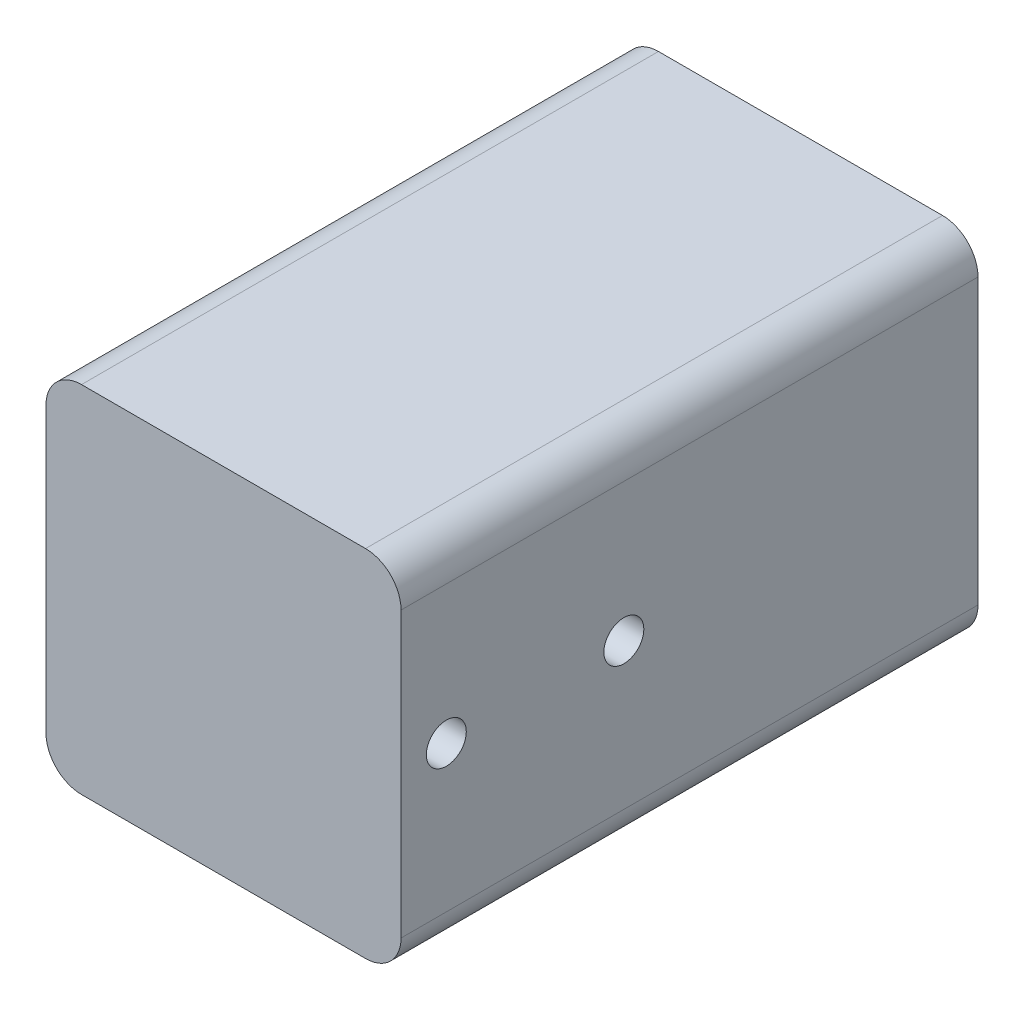
ISO-10303-21;
HEADER;
FILE_DESCRIPTION(('STEP AP214'),'2;1');
FILE_NAME('part.step','',(''),(''),'','','');
FILE_SCHEMA(('AUTOMOTIVE_DESIGN { 1 0 10303 214 1 1 1 1 }'));
ENDSEC;
DATA;
#1=APPLICATION_CONTEXT('core data for automotive mechanical design processes');
#2=APPLICATION_PROTOCOL_DEFINITION('international standard','automotive_design',2000,#1);
#3=PRODUCT_CONTEXT('',#1,'mechanical');
#4=PRODUCT('Part','Part','',(#3));
#5=PRODUCT_RELATED_PRODUCT_CATEGORY('part','',(#4));
#6=PRODUCT_DEFINITION_FORMATION('','',#4);
#7=PRODUCT_DEFINITION_CONTEXT('part definition',#1,'design');
#8=PRODUCT_DEFINITION('design','',#6,#7);
#9=PRODUCT_DEFINITION_SHAPE('','',#8);
#10=(LENGTH_UNIT() NAMED_UNIT(*) SI_UNIT(.MILLI.,.METRE.));
#11=(NAMED_UNIT(*) PLANE_ANGLE_UNIT() SI_UNIT($,.RADIAN.));
#12=(NAMED_UNIT(*) SI_UNIT($,.STERADIAN.) SOLID_ANGLE_UNIT());
#13=UNCERTAINTY_MEASURE_WITH_UNIT(LENGTH_MEASURE(1.E-05),#10,'distance_accuracy_value','');
#14=(GEOMETRIC_REPRESENTATION_CONTEXT(3) GLOBAL_UNCERTAINTY_ASSIGNED_CONTEXT((#13)) GLOBAL_UNIT_ASSIGNED_CONTEXT((#10,
#11,#12)) REPRESENTATION_CONTEXT('',''));
#15=CARTESIAN_POINT('',(0.,0.,0.));
#16=DIRECTION('',(0.,0.,1.));
#17=DIRECTION('',(1.,0.,0.));
#18=AXIS2_PLACEMENT_3D('',#15,#16,#17);
#19=CARTESIAN_POINT('',(-16.,-16.,0.));
#20=DIRECTION('',(0.,0.,1.));
#21=DIRECTION('',(1.,0.,0.));
#22=AXIS2_PLACEMENT_3D('',#19,#20,#21);
#23=PLANE('',#22);
#24=CARTESIAN_POINT('',(-12.3743686707646,12.3743686707653,0.));
#25=DIRECTION('',(0.,0.,-1.));
#26=DIRECTION('',(-1.,0.,0.));
#27=AXIS2_PLACEMENT_3D('',#24,#25,#26);
#28=CIRCLE('',#27,3.29999999999999);
#29=CARTESIAN_POINT('',(-15.6743686707646,12.3743686707653,0.));
#30=VERTEX_POINT('',#29);
#31=EDGE_CURVE('E201',#30,#30,#28,.T.);
#32=ORIENTED_EDGE('',*,*,#31,.F.);
#33=EDGE_LOOP('',(#32));
#34=FACE_BOUND('',#33,.T.);
#35=CARTESIAN_POINT('',(12.3743686707646,12.3743686707646,0.));
#36=DIRECTION('',(0.,0.,-1.));
#37=DIRECTION('',(-1.,0.,0.));
#38=AXIS2_PLACEMENT_3D('',#35,#36,#37);
#39=CIRCLE('',#38,3.29999999999999);
#40=CARTESIAN_POINT('',(9.0743686707646,12.3743686707646,0.));
#41=VERTEX_POINT('',#40);
#42=EDGE_CURVE('E195',#41,#41,#39,.T.);
#43=ORIENTED_EDGE('',*,*,#42,.F.);
#44=EDGE_LOOP('',(#43));
#45=FACE_BOUND('',#44,.T.);
#46=CARTESIAN_POINT('',(12.3743686707639,-12.3743686707646,0.));
#47=DIRECTION('',(0.,0.,-1.));
#48=DIRECTION('',(-1.,0.,0.));
#49=AXIS2_PLACEMENT_3D('',#46,#47,#48);
#50=CIRCLE('',#49,3.29999999999999);
#51=CARTESIAN_POINT('',(9.07436867076389,-12.3743686707646,0.));
#52=VERTEX_POINT('',#51);
#53=EDGE_CURVE('E189',#52,#52,#50,.T.);
#54=ORIENTED_EDGE('',*,*,#53,.F.);
#55=EDGE_LOOP('',(#54));
#56=FACE_BOUND('',#55,.T.);
#57=CARTESIAN_POINT('',(-16.,-16.,0.));
#58=DIRECTION('',(0.,0.,1.));
#59=DIRECTION('',(1.,0.,0.));
#60=AXIS2_PLACEMENT_3D('',#57,#58,#59);
#61=CIRCLE('',#60,4.);
#62=CARTESIAN_POINT('',(-20.,-16.,0.));
#63=VERTEX_POINT('',#62);
#64=CARTESIAN_POINT('',(-16.,-20.,0.));
#65=VERTEX_POINT('',#64);
#66=EDGE_CURVE('E133',#63,#65,#61,.T.);
#67=ORIENTED_EDGE('',*,*,#66,.F.);
#68=DIRECTION('',(0.,-1.,0.));
#69=VECTOR('',#68,1.);
#70=CARTESIAN_POINT('',(-20.,-16.,0.));
#71=LINE('',#70,#69);
#72=CARTESIAN_POINT('',(-20.,16.,0.));
#73=VERTEX_POINT('',#72);
#74=EDGE_CURVE('E86',#73,#63,#71,.T.);
#75=ORIENTED_EDGE('',*,*,#74,.F.);
#76=CARTESIAN_POINT('',(-16.,16.,0.));
#77=DIRECTION('',(0.,0.,1.));
#78=DIRECTION('',(-1.,0.,0.));
#79=AXIS2_PLACEMENT_3D('',#76,#77,#78);
#80=CIRCLE('',#79,4.);
#81=CARTESIAN_POINT('',(-16.,20.,0.));
#82=VERTEX_POINT('',#81);
#83=EDGE_CURVE('E80',#82,#73,#80,.T.);
#84=ORIENTED_EDGE('',*,*,#83,.F.);
#85=DIRECTION('',(-1.,0.,0.));
#86=VECTOR('',#85,1.);
#87=CARTESIAN_POINT('',(-16.,20.,0.));
#88=LINE('',#87,#86);
#89=CARTESIAN_POINT('',(16.,20.,0.));
#90=VERTEX_POINT('',#89);
#91=EDGE_CURVE('E123',#90,#82,#88,.T.);
#92=ORIENTED_EDGE('',*,*,#91,.F.);
#93=CARTESIAN_POINT('',(16.,16.,0.));
#94=DIRECTION('',(0.,0.,1.));
#95=DIRECTION('',(1.,0.,0.));
#96=AXIS2_PLACEMENT_3D('',#93,#94,#95);
#97=CIRCLE('',#96,4.);
#98=CARTESIAN_POINT('',(20.,16.,0.));
#99=VERTEX_POINT('',#98);
#100=EDGE_CURVE('E143',#99,#90,#97,.T.);
#101=ORIENTED_EDGE('',*,*,#100,.F.);
#102=DIRECTION('',(0.,1.,0.));
#103=VECTOR('',#102,1.);
#104=CARTESIAN_POINT('',(20.,-16.,0.));
#105=LINE('',#104,#103);
#106=CARTESIAN_POINT('',(20.,-16.,0.));
#107=VERTEX_POINT('',#106);
#108=EDGE_CURVE('E141',#107,#99,#105,.T.);
#109=ORIENTED_EDGE('',*,*,#108,.F.);
#110=CARTESIAN_POINT('',(16.,-16.,0.));
#111=DIRECTION('',(0.,0.,1.));
#112=DIRECTION('',(1.,0.,0.));
#113=AXIS2_PLACEMENT_3D('',#110,#111,#112);
#114=CIRCLE('',#113,4.);
#115=CARTESIAN_POINT('',(16.,-20.,0.));
#116=VERTEX_POINT('',#115);
#117=EDGE_CURVE('E139',#116,#107,#114,.T.);
#118=ORIENTED_EDGE('',*,*,#117,.F.);
#119=DIRECTION('',(1.,0.,0.));
#120=VECTOR('',#119,1.);
#121=CARTESIAN_POINT('',(-16.,-20.,0.));
#122=LINE('',#121,#120);
#123=EDGE_CURVE('E136',#65,#116,#122,.T.);
#124=ORIENTED_EDGE('',*,*,#123,.F.);
#125=EDGE_LOOP('',(#67,#75,#84,#92,#101,#109,#118,#124));
#126=FACE_BOUND('',#125,.T.);
#127=CARTESIAN_POINT('',(-12.3743686707653,-12.3743686707639,0.));
#128=DIRECTION('',(0.,0.,-1.));
#129=DIRECTION('',(-1.,0.,0.));
#130=AXIS2_PLACEMENT_3D('',#127,#128,#129);
#131=CIRCLE('',#130,3.29999999999999);
#132=CARTESIAN_POINT('',(-15.6743686707653,-12.3743686707639,0.));
#133=VERTEX_POINT('',#132);
#134=EDGE_CURVE('E183',#133,#133,#131,.T.);
#135=ORIENTED_EDGE('',*,*,#134,.F.);
#136=EDGE_LOOP('',(#135));
#137=FACE_BOUND('',#136,.T.);
#138=ADVANCED_FACE('F33',(#34,#45,#56,#126,#137),#23,.F.);
#139=CARTESIAN_POINT('',(-16.,-16.,65.));
#140=DIRECTION('',(0.,0.,-1.));
#141=DIRECTION('',(-1.,0.,0.));
#142=AXIS2_PLACEMENT_3D('',#139,#140,#141);
#143=CYLINDRICAL_SURFACE('',#142,4.);
#144=ORIENTED_EDGE('',*,*,#66,.T.);
#145=DIRECTION('',(0.,0.,-1.));
#146=VECTOR('',#145,1.);
#147=CARTESIAN_POINT('',(-16.,-20.,65.));
#148=LINE('',#147,#146);
#149=CARTESIAN_POINT('',(-16.,-20.,65.));
#150=VERTEX_POINT('',#149);
#151=EDGE_CURVE('E11',#150,#65,#148,.T.);
#152=ORIENTED_EDGE('',*,*,#151,.F.);
#153=CARTESIAN_POINT('',(-16.,-16.,65.));
#154=DIRECTION('',(0.,0.,1.));
#155=DIRECTION('',(1.,0.,0.));
#156=AXIS2_PLACEMENT_3D('',#153,#154,#155);
#157=CIRCLE('',#156,4.);
#158=CARTESIAN_POINT('',(-20.,-16.,65.));
#159=VERTEX_POINT('',#158);
#160=EDGE_CURVE('E148',#159,#150,#157,.T.);
#161=ORIENTED_EDGE('',*,*,#160,.F.);
#162=DIRECTION('',(0.,0.,-1.));
#163=VECTOR('',#162,1.);
#164=CARTESIAN_POINT('',(-20.,-16.,65.));
#165=LINE('',#164,#163);
#166=EDGE_CURVE('E129',#159,#63,#165,.T.);
#167=ORIENTED_EDGE('',*,*,#166,.T.);
#168=EDGE_LOOP('',(#144,#152,#161,#167));
#169=FACE_BOUND('',#168,.T.);
#170=ADVANCED_FACE('F35',(#169),#143,.T.);
#171=CARTESIAN_POINT('',(-16.,-20.,65.));
#172=DIRECTION('',(0.,1.,0.));
#173=DIRECTION('',(0.,0.,1.));
#174=AXIS2_PLACEMENT_3D('',#171,#172,#173);
#175=PLANE('',#174);
#176=ORIENTED_EDGE('',*,*,#123,.T.);
#177=DIRECTION('',(0.,0.,-1.));
#178=VECTOR('',#177,1.);
#179=CARTESIAN_POINT('',(16.,-20.,65.));
#180=LINE('',#179,#178);
#181=CARTESIAN_POINT('',(16.,-20.,65.));
#182=VERTEX_POINT('',#181);
#183=EDGE_CURVE('E42',#182,#116,#180,.T.);
#184=ORIENTED_EDGE('',*,*,#183,.F.);
#185=DIRECTION('',(1.,0.,0.));
#186=VECTOR('',#185,1.);
#187=CARTESIAN_POINT('',(-16.,-20.,65.));
#188=LINE('',#187,#186);
#189=EDGE_CURVE('E94',#150,#182,#188,.T.);
#190=ORIENTED_EDGE('',*,*,#189,.F.);
#191=ORIENTED_EDGE('',*,*,#151,.T.);
#192=EDGE_LOOP('',(#176,#184,#190,#191));
#193=FACE_BOUND('',#192,.T.);
#194=ADVANCED_FACE('F248',(#193),#175,.F.);
#195=CARTESIAN_POINT('',(16.,-16.,65.));
#196=DIRECTION('',(0.,0.,-1.));
#197=DIRECTION('',(-1.,0.,0.));
#198=AXIS2_PLACEMENT_3D('',#195,#196,#197);
#199=CYLINDRICAL_SURFACE('',#198,4.);
#200=ORIENTED_EDGE('',*,*,#117,.T.);
#201=DIRECTION('',(0.,0.,-1.));
#202=VECTOR('',#201,1.);
#203=CARTESIAN_POINT('',(20.,-16.,65.));
#204=LINE('',#203,#202);
#205=CARTESIAN_POINT('',(20.,-16.,65.));
#206=VERTEX_POINT('',#205);
#207=EDGE_CURVE('E155',#206,#107,#204,.T.);
#208=ORIENTED_EDGE('',*,*,#207,.F.);
#209=CARTESIAN_POINT('',(16.,-16.,65.));
#210=DIRECTION('',(0.,0.,1.));
#211=DIRECTION('',(1.,0.,0.));
#212=AXIS2_PLACEMENT_3D('',#209,#210,#211);
#213=CIRCLE('',#212,4.);
#214=EDGE_CURVE('E163',#182,#206,#213,.T.);
#215=ORIENTED_EDGE('',*,*,#214,.F.);
#216=ORIENTED_EDGE('',*,*,#183,.T.);
#217=EDGE_LOOP('',(#200,#208,#215,#216));
#218=FACE_BOUND('',#217,.T.);
#219=ADVANCED_FACE('F161',(#218),#199,.T.);
#220=CARTESIAN_POINT('',(20.,-16.,65.));
#221=DIRECTION('',(-1.,0.,0.));
#222=DIRECTION('',(0.,0.,1.));
#223=AXIS2_PLACEMENT_3D('',#220,#221,#222);
#224=PLANE('',#223);
#225=CARTESIAN_POINT('',(20.,0.46049902811721,59.8999999991176));
#226=DIRECTION('',(1.,0.,0.));
#227=DIRECTION('',(0.,0.,-1.));
#228=AXIS2_PLACEMENT_3D('',#225,#226,#227);
#229=CIRCLE('',#228,2.25);
#230=CARTESIAN_POINT('',(20.,0.46049902811721,57.6499999991176));
#231=VERTEX_POINT('',#230);
#232=EDGE_CURVE('E213',#231,#231,#229,.T.);
#233=ORIENTED_EDGE('',*,*,#232,.F.);
#234=EDGE_LOOP('',(#233));
#235=FACE_BOUND('',#234,.T.);
#236=CARTESIAN_POINT('',(20.,0.460499028117237,39.8999999991176));
#237=DIRECTION('',(1.,0.,0.));
#238=DIRECTION('',(0.,0.,-1.));
#239=AXIS2_PLACEMENT_3D('',#236,#237,#238);
#240=CIRCLE('',#239,2.25);
#241=CARTESIAN_POINT('',(20.,0.460499028117237,37.6499999991176));
#242=VERTEX_POINT('',#241);
#243=EDGE_CURVE('E207',#242,#242,#240,.T.);
#244=ORIENTED_EDGE('',*,*,#243,.F.);
#245=EDGE_LOOP('',(#244));
#246=FACE_BOUND('',#245,.T.);
#247=ORIENTED_EDGE('',*,*,#108,.T.);
#248=DIRECTION('',(0.,0.,-1.));
#249=VECTOR('',#248,1.);
#250=CARTESIAN_POINT('',(20.,16.,65.));
#251=LINE('',#250,#249);
#252=CARTESIAN_POINT('',(20.,16.,65.));
#253=VERTEX_POINT('',#252);
#254=EDGE_CURVE('E152',#253,#99,#251,.T.);
#255=ORIENTED_EDGE('',*,*,#254,.F.);
#256=DIRECTION('',(0.,1.,0.));
#257=VECTOR('',#256,1.);
#258=CARTESIAN_POINT('',(20.,-16.,65.));
#259=LINE('',#258,#257);
#260=EDGE_CURVE('E175',#206,#253,#259,.T.);
#261=ORIENTED_EDGE('',*,*,#260,.F.);
#262=ORIENTED_EDGE('',*,*,#207,.T.);
#263=EDGE_LOOP('',(#247,#255,#261,#262));
#264=FACE_BOUND('',#263,.T.);
#265=ADVANCED_FACE('F171',(#235,#246,#264),#224,.F.);
#266=CARTESIAN_POINT('',(16.,16.,65.));
#267=DIRECTION('',(0.,0.,-1.));
#268=DIRECTION('',(-1.,0.,0.));
#269=AXIS2_PLACEMENT_3D('',#266,#267,#268);
#270=CYLINDRICAL_SURFACE('',#269,4.);
#271=ORIENTED_EDGE('',*,*,#100,.T.);
#272=DIRECTION('',(0.,0.,-1.));
#273=VECTOR('',#272,1.);
#274=CARTESIAN_POINT('',(16.,20.,65.));
#275=LINE('',#274,#273);
#276=CARTESIAN_POINT('',(16.,20.,65.));
#277=VERTEX_POINT('',#276);
#278=EDGE_CURVE('E124',#277,#90,#275,.T.);
#279=ORIENTED_EDGE('',*,*,#278,.F.);
#280=CARTESIAN_POINT('',(16.,16.,65.));
#281=DIRECTION('',(0.,0.,1.));
#282=DIRECTION('',(1.,0.,0.));
#283=AXIS2_PLACEMENT_3D('',#280,#281,#282);
#284=CIRCLE('',#283,4.);
#285=EDGE_CURVE('E115',#253,#277,#284,.T.);
#286=ORIENTED_EDGE('',*,*,#285,.F.);
#287=ORIENTED_EDGE('',*,*,#254,.T.);
#288=EDGE_LOOP('',(#271,#279,#286,#287));
#289=FACE_BOUND('',#288,.T.);
#290=ADVANCED_FACE('F174',(#289),#270,.T.);
#291=CARTESIAN_POINT('',(-16.,20.,65.));
#292=DIRECTION('',(0.,-1.,0.));
#293=DIRECTION('',(0.,0.,-1.));
#294=AXIS2_PLACEMENT_3D('',#291,#292,#293);
#295=PLANE('',#294);
#296=ORIENTED_EDGE('',*,*,#91,.T.);
#297=DIRECTION('',(0.,0.,-1.));
#298=VECTOR('',#297,1.);
#299=CARTESIAN_POINT('',(-16.,20.,65.));
#300=LINE('',#299,#298);
#301=CARTESIAN_POINT('',(-16.,20.,65.));
#302=VERTEX_POINT('',#301);
#303=EDGE_CURVE('E120',#302,#82,#300,.T.);
#304=ORIENTED_EDGE('',*,*,#303,.F.);
#305=DIRECTION('',(-1.,0.,0.));
#306=VECTOR('',#305,1.);
#307=CARTESIAN_POINT('',(-16.,20.,65.));
#308=LINE('',#307,#306);
#309=EDGE_CURVE('E109',#277,#302,#308,.T.);
#310=ORIENTED_EDGE('',*,*,#309,.F.);
#311=ORIENTED_EDGE('',*,*,#278,.T.);
#312=EDGE_LOOP('',(#296,#304,#310,#311));
#313=FACE_BOUND('',#312,.T.);
#314=ADVANCED_FACE('F121',(#313),#295,.F.);
#315=CARTESIAN_POINT('',(-16.,16.,65.));
#316=DIRECTION('',(0.,0.,-1.));
#317=DIRECTION('',(-1.,0.,0.));
#318=AXIS2_PLACEMENT_3D('',#315,#316,#317);
#319=CYLINDRICAL_SURFACE('',#318,4.);
#320=ORIENTED_EDGE('',*,*,#83,.T.);
#321=DIRECTION('',(0.,0.,-1.));
#322=VECTOR('',#321,1.);
#323=CARTESIAN_POINT('',(-20.,16.,65.));
#324=LINE('',#323,#322);
#325=CARTESIAN_POINT('',(-20.,16.,65.));
#326=VERTEX_POINT('',#325);
#327=EDGE_CURVE('E125',#326,#73,#324,.T.);
#328=ORIENTED_EDGE('',*,*,#327,.F.);
#329=CARTESIAN_POINT('',(-16.,16.,65.));
#330=DIRECTION('',(0.,0.,1.));
#331=DIRECTION('',(-1.,0.,0.));
#332=AXIS2_PLACEMENT_3D('',#329,#330,#331);
#333=CIRCLE('',#332,4.);
#334=EDGE_CURVE('E113',#302,#326,#333,.T.);
#335=ORIENTED_EDGE('',*,*,#334,.F.);
#336=ORIENTED_EDGE('',*,*,#303,.T.);
#337=EDGE_LOOP('',(#320,#328,#335,#336));
#338=FACE_BOUND('',#337,.T.);
#339=ADVANCED_FACE('F127',(#338),#319,.T.);
#340=CARTESIAN_POINT('',(-20.,-16.,65.));
#341=DIRECTION('',(1.,0.,0.));
#342=DIRECTION('',(0.,0.,-1.));
#343=AXIS2_PLACEMENT_3D('',#340,#341,#342);
#344=PLANE('',#343);
#345=ORIENTED_EDGE('',*,*,#74,.T.);
#346=ORIENTED_EDGE('',*,*,#166,.F.);
#347=DIRECTION('',(0.,-1.,0.));
#348=VECTOR('',#347,1.);
#349=CARTESIAN_POINT('',(-20.,-16.,65.));
#350=LINE('',#349,#348);
#351=EDGE_CURVE('E50',#326,#159,#350,.T.);
#352=ORIENTED_EDGE('',*,*,#351,.F.);
#353=ORIENTED_EDGE('',*,*,#327,.T.);
#354=EDGE_LOOP('',(#345,#346,#352,#353));
#355=FACE_BOUND('',#354,.T.);
#356=ADVANCED_FACE('F255',(#355),#344,.F.);
#357=CARTESIAN_POINT('',(-16.,-16.,65.));
#358=DIRECTION('',(0.,0.,1.));
#359=DIRECTION('',(1.,0.,0.));
#360=AXIS2_PLACEMENT_3D('',#357,#358,#359);
#361=PLANE('',#360);
#362=ORIENTED_EDGE('',*,*,#160,.T.);
#363=ORIENTED_EDGE('',*,*,#189,.T.);
#364=ORIENTED_EDGE('',*,*,#214,.T.);
#365=ORIENTED_EDGE('',*,*,#260,.T.);
#366=ORIENTED_EDGE('',*,*,#285,.T.);
#367=ORIENTED_EDGE('',*,*,#309,.T.);
#368=ORIENTED_EDGE('',*,*,#334,.T.);
#369=ORIENTED_EDGE('',*,*,#351,.T.);
#370=EDGE_LOOP('',(#362,#363,#364,#365,#366,#367,#368,#369));
#371=FACE_BOUND('',#370,.T.);
#372=ADVANCED_FACE('F111',(#371),#361,.T.);
#373=CARTESIAN_POINT('',(-12.3743686707653,-12.3743686707639,5.));
#374=DIRECTION('',(0.,0.,-1.));
#375=DIRECTION('',(-1.,0.,0.));
#376=AXIS2_PLACEMENT_3D('',#373,#374,#375);
#377=CONICAL_SURFACE('',#376,3.3,1.02974425867665);
#378=CARTESIAN_POINT('',(-12.3743686707653,-12.3743686707639,6.98284004279095));
#379=VERTEX_POINT('',#378);
#380=VERTEX_LOOP('',#379);
#381=FACE_BOUND('',#380,.T.);
#382=CARTESIAN_POINT('',(-12.3743686707653,-12.3743686707639,5.));
#383=DIRECTION('',(0.,0.,-1.));
#384=DIRECTION('',(-1.,0.,0.));
#385=AXIS2_PLACEMENT_3D('',#382,#383,#384);
#386=CIRCLE('',#385,3.3);
#387=CARTESIAN_POINT('',(-15.6743686707653,-12.3743686707639,5.));
#388=VERTEX_POINT('',#387);
#389=EDGE_CURVE('E137',#388,#388,#386,.T.);
#390=ORIENTED_EDGE('',*,*,#389,.T.);
#391=EDGE_LOOP('',(#390));
#392=FACE_BOUND('',#391,.T.);
#393=ADVANCED_FACE('F305',(#381,#392),#377,.F.);
#394=CARTESIAN_POINT('',(-12.3743686707653,-12.3743686707639,0.));
#395=DIRECTION('',(0.,0.,-1.));
#396=DIRECTION('',(-1.,0.,0.));
#397=AXIS2_PLACEMENT_3D('',#394,#395,#396);
#398=CYLINDRICAL_SURFACE('',#397,3.29999999999999);
#399=ORIENTED_EDGE('',*,*,#389,.F.);
#400=EDGE_LOOP('',(#399));
#401=FACE_BOUND('',#400,.T.);
#402=ORIENTED_EDGE('',*,*,#134,.T.);
#403=EDGE_LOOP('',(#402));
#404=FACE_BOUND('',#403,.T.);
#405=ADVANCED_FACE('F315',(#401,#404),#398,.F.);
#406=CARTESIAN_POINT('',(12.3743686707639,-12.3743686707646,5.));
#407=DIRECTION('',(0.,0.,-1.));
#408=DIRECTION('',(-1.,0.,0.));
#409=AXIS2_PLACEMENT_3D('',#406,#407,#408);
#410=CONICAL_SURFACE('',#409,3.3,1.02974425867665);
#411=CARTESIAN_POINT('',(12.3743686707639,-12.3743686707646,6.98284004279095));
#412=VERTEX_POINT('',#411);
#413=VERTEX_LOOP('',#412);
#414=FACE_BOUND('',#413,.T.);
#415=CARTESIAN_POINT('',(12.3743686707639,-12.3743686707646,5.));
#416=DIRECTION('',(0.,0.,-1.));
#417=DIRECTION('',(-1.,0.,0.));
#418=AXIS2_PLACEMENT_3D('',#415,#416,#417);
#419=CIRCLE('',#418,3.3);
#420=CARTESIAN_POINT('',(9.07436867076388,-12.3743686707646,5.));
#421=VERTEX_POINT('',#420);
#422=EDGE_CURVE('E186',#421,#421,#419,.T.);
#423=ORIENTED_EDGE('',*,*,#422,.T.);
#424=EDGE_LOOP('',(#423));
#425=FACE_BOUND('',#424,.T.);
#426=ADVANCED_FACE('F321',(#414,#425),#410,.F.);
#427=CARTESIAN_POINT('',(12.3743686707639,-12.3743686707646,0.));
#428=DIRECTION('',(0.,0.,-1.));
#429=DIRECTION('',(-1.,0.,0.));
#430=AXIS2_PLACEMENT_3D('',#427,#428,#429);
#431=CYLINDRICAL_SURFACE('',#430,3.29999999999999);
#432=ORIENTED_EDGE('',*,*,#422,.F.);
#433=EDGE_LOOP('',(#432));
#434=FACE_BOUND('',#433,.T.);
#435=ORIENTED_EDGE('',*,*,#53,.T.);
#436=EDGE_LOOP('',(#435));
#437=FACE_BOUND('',#436,.T.);
#438=ADVANCED_FACE('F329',(#434,#437),#431,.F.);
#439=CARTESIAN_POINT('',(12.3743686707646,12.3743686707646,5.));
#440=DIRECTION('',(0.,0.,-1.));
#441=DIRECTION('',(-1.,0.,0.));
#442=AXIS2_PLACEMENT_3D('',#439,#440,#441);
#443=CONICAL_SURFACE('',#442,3.3,1.02974425867665);
#444=CARTESIAN_POINT('',(12.3743686707646,12.3743686707646,6.98284004279095));
#445=VERTEX_POINT('',#444);
#446=VERTEX_LOOP('',#445);
#447=FACE_BOUND('',#446,.T.);
#448=CARTESIAN_POINT('',(12.3743686707646,12.3743686707646,5.));
#449=DIRECTION('',(0.,0.,-1.));
#450=DIRECTION('',(-1.,0.,0.));
#451=AXIS2_PLACEMENT_3D('',#448,#449,#450);
#452=CIRCLE('',#451,3.3);
#453=CARTESIAN_POINT('',(9.0743686707646,12.3743686707646,5.));
#454=VERTEX_POINT('',#453);
#455=EDGE_CURVE('E192',#454,#454,#452,.T.);
#456=ORIENTED_EDGE('',*,*,#455,.T.);
#457=EDGE_LOOP('',(#456));
#458=FACE_BOUND('',#457,.T.);
#459=ADVANCED_FACE('F337',(#447,#458),#443,.F.);
#460=CARTESIAN_POINT('',(12.3743686707646,12.3743686707646,0.));
#461=DIRECTION('',(0.,0.,-1.));
#462=DIRECTION('',(-1.,0.,0.));
#463=AXIS2_PLACEMENT_3D('',#460,#461,#462);
#464=CYLINDRICAL_SURFACE('',#463,3.29999999999999);
#465=ORIENTED_EDGE('',*,*,#455,.F.);
#466=EDGE_LOOP('',(#465));
#467=FACE_BOUND('',#466,.T.);
#468=ORIENTED_EDGE('',*,*,#42,.T.);
#469=EDGE_LOOP('',(#468));
#470=FACE_BOUND('',#469,.T.);
#471=ADVANCED_FACE('F345',(#467,#470),#464,.F.);
#472=CARTESIAN_POINT('',(-12.3743686707646,12.3743686707653,5.));
#473=DIRECTION('',(0.,0.,-1.));
#474=DIRECTION('',(-1.,0.,0.));
#475=AXIS2_PLACEMENT_3D('',#472,#473,#474);
#476=CONICAL_SURFACE('',#475,3.3,1.02974425867665);
#477=CARTESIAN_POINT('',(-12.3743686707646,12.3743686707653,6.98284004279095));
#478=VERTEX_POINT('',#477);
#479=VERTEX_LOOP('',#478);
#480=FACE_BOUND('',#479,.T.);
#481=CARTESIAN_POINT('',(-12.3743686707646,12.3743686707653,5.));
#482=DIRECTION('',(0.,0.,-1.));
#483=DIRECTION('',(-1.,0.,0.));
#484=AXIS2_PLACEMENT_3D('',#481,#482,#483);
#485=CIRCLE('',#484,3.3);
#486=CARTESIAN_POINT('',(-15.6743686707646,12.3743686707653,5.));
#487=VERTEX_POINT('',#486);
#488=EDGE_CURVE('E198',#487,#487,#485,.T.);
#489=ORIENTED_EDGE('',*,*,#488,.T.);
#490=EDGE_LOOP('',(#489));
#491=FACE_BOUND('',#490,.T.);
#492=ADVANCED_FACE('F353',(#480,#491),#476,.F.);
#493=CARTESIAN_POINT('',(-12.3743686707646,12.3743686707653,0.));
#494=DIRECTION('',(0.,0.,-1.));
#495=DIRECTION('',(-1.,0.,0.));
#496=AXIS2_PLACEMENT_3D('',#493,#494,#495);
#497=CYLINDRICAL_SURFACE('',#496,3.29999999999999);
#498=ORIENTED_EDGE('',*,*,#488,.F.);
#499=EDGE_LOOP('',(#498));
#500=FACE_BOUND('',#499,.T.);
#501=ORIENTED_EDGE('',*,*,#31,.T.);
#502=EDGE_LOOP('',(#501));
#503=FACE_BOUND('',#502,.T.);
#504=ADVANCED_FACE('F236',(#500,#503),#497,.F.);
#505=CARTESIAN_POINT('',(15.,0.460499028117237,39.8999999991176));
#506=DIRECTION('',(1.,0.,0.));
#507=DIRECTION('',(0.,0.,-1.));
#508=AXIS2_PLACEMENT_3D('',#505,#506,#507);
#509=CONICAL_SURFACE('',#508,2.25,1.02974425867665);
#510=CARTESIAN_POINT('',(13.648063607188,0.460499028117236,39.8999999991176));
#511=VERTEX_POINT('',#510);
#512=VERTEX_LOOP('',#511);
#513=FACE_BOUND('',#512,.T.);
#514=CARTESIAN_POINT('',(15.,0.460499028117237,39.8999999991176));
#515=DIRECTION('',(1.,0.,0.));
#516=DIRECTION('',(0.,0.,-1.));
#517=AXIS2_PLACEMENT_3D('',#514,#515,#516);
#518=CIRCLE('',#517,2.25);
#519=CARTESIAN_POINT('',(15.,0.460499028117237,37.6499999991176));
#520=VERTEX_POINT('',#519);
#521=EDGE_CURVE('E204',#520,#520,#518,.T.);
#522=ORIENTED_EDGE('',*,*,#521,.T.);
#523=EDGE_LOOP('',(#522));
#524=FACE_BOUND('',#523,.T.);
#525=ADVANCED_FACE('F227',(#513,#524),#509,.F.);
#526=CARTESIAN_POINT('',(20.,0.460499028117237,39.8999999991176));
#527=DIRECTION('',(1.,0.,0.));
#528=DIRECTION('',(0.,0.,-1.));
#529=AXIS2_PLACEMENT_3D('',#526,#527,#528);
#530=CYLINDRICAL_SURFACE('',#529,2.25);
#531=ORIENTED_EDGE('',*,*,#521,.F.);
#532=EDGE_LOOP('',(#531));
#533=FACE_BOUND('',#532,.T.);
#534=ORIENTED_EDGE('',*,*,#243,.T.);
#535=EDGE_LOOP('',(#534));
#536=FACE_BOUND('',#535,.T.);
#537=ADVANCED_FACE('F224',(#533,#536),#530,.F.);
#538=CARTESIAN_POINT('',(15.,0.46049902811721,59.8999999991176));
#539=DIRECTION('',(1.,0.,0.));
#540=DIRECTION('',(0.,0.,-1.));
#541=AXIS2_PLACEMENT_3D('',#538,#539,#540);
#542=CONICAL_SURFACE('',#541,2.25,1.02974425867665);
#543=CARTESIAN_POINT('',(13.648063607188,0.460499028117208,59.8999999991176));
#544=VERTEX_POINT('',#543);
#545=VERTEX_LOOP('',#544);
#546=FACE_BOUND('',#545,.T.);
#547=CARTESIAN_POINT('',(15.,0.46049902811721,59.8999999991176));
#548=DIRECTION('',(1.,0.,0.));
#549=DIRECTION('',(0.,0.,-1.));
#550=AXIS2_PLACEMENT_3D('',#547,#548,#549);
#551=CIRCLE('',#550,2.25);
#552=CARTESIAN_POINT('',(15.,0.46049902811721,57.6499999991176));
#553=VERTEX_POINT('',#552);
#554=EDGE_CURVE('E210',#553,#553,#551,.T.);
#555=ORIENTED_EDGE('',*,*,#554,.T.);
#556=EDGE_LOOP('',(#555));
#557=FACE_BOUND('',#556,.T.);
#558=ADVANCED_FACE('F226',(#546,#557),#542,.F.);
#559=CARTESIAN_POINT('',(20.,0.46049902811721,59.8999999991176));
#560=DIRECTION('',(1.,0.,0.));
#561=DIRECTION('',(0.,0.,-1.));
#562=AXIS2_PLACEMENT_3D('',#559,#560,#561);
#563=CYLINDRICAL_SURFACE('',#562,2.25);
#564=ORIENTED_EDGE('',*,*,#554,.F.);
#565=EDGE_LOOP('',(#564));
#566=FACE_BOUND('',#565,.T.);
#567=ORIENTED_EDGE('',*,*,#232,.T.);
#568=EDGE_LOOP('',(#567));
#569=FACE_BOUND('',#568,.T.);
#570=ADVANCED_FACE('F217',(#566,#569),#563,.F.);
#571=CLOSED_SHELL('',(#138,#170,#194,#219,#265,#290,#314,#339,#356,#372,#393,#405,#426,#438,
#459,#471,#492,#504,#525,#537,#558,#570));
#572=MANIFOLD_SOLID_BREP('B2',#571);
#573=ADVANCED_BREP_SHAPE_REPRESENTATION('',(#18,#572),#14);
#574=SHAPE_DEFINITION_REPRESENTATION(#9,#573);
ENDSEC;
END-ISO-10303-21;
